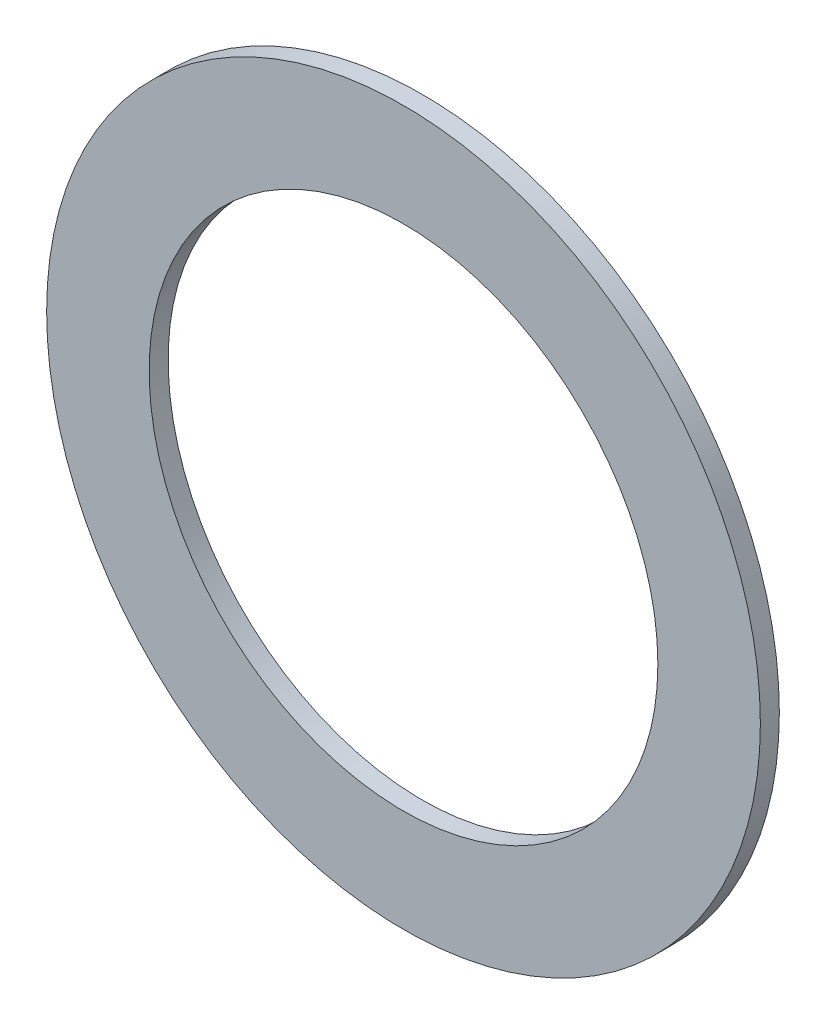
ISO-10303-21;
HEADER;
FILE_DESCRIPTION(('STEP AP214'),'2;1');
FILE_NAME('part.step','',(''),(''),'','','');
FILE_SCHEMA(('AUTOMOTIVE_DESIGN { 1 0 10303 214 1 1 1 1 }'));
ENDSEC;
DATA;
#1=APPLICATION_CONTEXT('core data for automotive mechanical design processes');
#2=APPLICATION_PROTOCOL_DEFINITION('international standard','automotive_design',2000,#1);
#3=PRODUCT_CONTEXT('',#1,'mechanical');
#4=PRODUCT('Part','Part','',(#3));
#5=PRODUCT_RELATED_PRODUCT_CATEGORY('part','',(#4));
#6=PRODUCT_DEFINITION_FORMATION('','',#4);
#7=PRODUCT_DEFINITION_CONTEXT('part definition',#1,'design');
#8=PRODUCT_DEFINITION('design','',#6,#7);
#9=PRODUCT_DEFINITION_SHAPE('','',#8);
#10=(LENGTH_UNIT() NAMED_UNIT(*) SI_UNIT(.MILLI.,.METRE.));
#11=(NAMED_UNIT(*) PLANE_ANGLE_UNIT() SI_UNIT($,.RADIAN.));
#12=(NAMED_UNIT(*) SI_UNIT($,.STERADIAN.) SOLID_ANGLE_UNIT());
#13=UNCERTAINTY_MEASURE_WITH_UNIT(LENGTH_MEASURE(1.E-05),#10,'distance_accuracy_value','');
#14=(GEOMETRIC_REPRESENTATION_CONTEXT(3) GLOBAL_UNCERTAINTY_ASSIGNED_CONTEXT((#13)) GLOBAL_UNIT_ASSIGNED_CONTEXT((#10,
#11,#12)) REPRESENTATION_CONTEXT('',''));
#15=CARTESIAN_POINT('',(0.,0.,0.));
#16=DIRECTION('',(0.,0.,1.));
#17=DIRECTION('',(1.,0.,0.));
#18=AXIS2_PLACEMENT_3D('',#15,#16,#17);
#19=CARTESIAN_POINT('',(0.,0.,0.5));
#20=DIRECTION('',(0.,0.,1.));
#21=DIRECTION('',(1.,0.,0.));
#22=AXIS2_PLACEMENT_3D('',#19,#20,#21);
#23=PLANE('',#22);
#24=CARTESIAN_POINT('',(0.,0.,0.5));
#25=DIRECTION('',(0.,0.,1.));
#26=DIRECTION('',(1.,0.,0.));
#27=AXIS2_PLACEMENT_3D('',#24,#25,#26);
#28=CIRCLE('',#27,9.4);
#29=CARTESIAN_POINT('',(9.4,0.,0.5));
#30=VERTEX_POINT('',#29);
#31=EDGE_CURVE('E10',#30,#30,#28,.T.);
#32=ORIENTED_EDGE('',*,*,#31,.T.);
#33=EDGE_LOOP('',(#32));
#34=FACE_BOUND('',#33,.T.);
#35=CARTESIAN_POINT('',(0.,0.,0.5));
#36=DIRECTION('',(0.,0.,1.));
#37=DIRECTION('',(1.,0.,0.));
#38=AXIS2_PLACEMENT_3D('',#35,#36,#37);
#39=CIRCLE('',#38,6.7);
#40=CARTESIAN_POINT('',(6.7,0.,0.5));
#41=VERTEX_POINT('',#40);
#42=EDGE_CURVE('E46',#41,#41,#39,.T.);
#43=ORIENTED_EDGE('',*,*,#42,.F.);
#44=EDGE_LOOP('',(#43));
#45=FACE_BOUND('',#44,.T.);
#46=ADVANCED_FACE('F35',(#34,#45),#23,.T.);
#47=CARTESIAN_POINT('',(0.,0.,0.));
#48=DIRECTION('',(0.,0.,1.));
#49=DIRECTION('',(1.,0.,0.));
#50=AXIS2_PLACEMENT_3D('',#47,#48,#49);
#51=PLANE('',#50);
#52=CARTESIAN_POINT('',(0.,0.,0.));
#53=DIRECTION('',(0.,0.,1.));
#54=DIRECTION('',(1.,0.,0.));
#55=AXIS2_PLACEMENT_3D('',#52,#53,#54);
#56=CIRCLE('',#55,9.4);
#57=CARTESIAN_POINT('',(9.4,0.,0.));
#58=VERTEX_POINT('',#57);
#59=EDGE_CURVE('E39',#58,#58,#56,.T.);
#60=ORIENTED_EDGE('',*,*,#59,.F.);
#61=EDGE_LOOP('',(#60));
#62=FACE_BOUND('',#61,.T.);
#63=CARTESIAN_POINT('',(0.,0.,0.));
#64=DIRECTION('',(0.,0.,1.));
#65=DIRECTION('',(1.,0.,0.));
#66=AXIS2_PLACEMENT_3D('',#63,#64,#65);
#67=CIRCLE('',#66,6.7);
#68=CARTESIAN_POINT('',(6.7,0.,0.));
#69=VERTEX_POINT('',#68);
#70=EDGE_CURVE('E48',#69,#69,#67,.T.);
#71=ORIENTED_EDGE('',*,*,#70,.T.);
#72=EDGE_LOOP('',(#71));
#73=FACE_BOUND('',#72,.T.);
#74=ADVANCED_FACE('F58',(#62,#73),#51,.F.);
#75=CARTESIAN_POINT('',(0.,0.,0.5));
#76=DIRECTION('',(0.,0.,-1.));
#77=DIRECTION('',(-1.,0.,0.));
#78=AXIS2_PLACEMENT_3D('',#75,#76,#77);
#79=CYLINDRICAL_SURFACE('',#78,9.4);
#80=ORIENTED_EDGE('',*,*,#31,.F.);
#81=EDGE_LOOP('',(#80));
#82=FACE_BOUND('',#81,.T.);
#83=ORIENTED_EDGE('',*,*,#59,.T.);
#84=EDGE_LOOP('',(#83));
#85=FACE_BOUND('',#84,.T.);
#86=ADVANCED_FACE('F37',(#82,#85),#79,.T.);
#87=CARTESIAN_POINT('',(0.,0.,0.5));
#88=DIRECTION('',(0.,0.,-1.));
#89=DIRECTION('',(-1.,0.,0.));
#90=AXIS2_PLACEMENT_3D('',#87,#88,#89);
#91=CYLINDRICAL_SURFACE('',#90,6.7);
#92=ORIENTED_EDGE('',*,*,#42,.T.);
#93=EDGE_LOOP('',(#92));
#94=FACE_BOUND('',#93,.T.);
#95=ORIENTED_EDGE('',*,*,#70,.F.);
#96=EDGE_LOOP('',(#95));
#97=FACE_BOUND('',#96,.T.);
#98=ADVANCED_FACE('F54',(#94,#97),#91,.F.);
#99=CLOSED_SHELL('',(#46,#74,#86,#98));
#100=MANIFOLD_SOLID_BREP('B2',#99);
#101=ADVANCED_BREP_SHAPE_REPRESENTATION('',(#18,#100),#14);
#102=SHAPE_DEFINITION_REPRESENTATION(#9,#101);
ENDSEC;
END-ISO-10303-21;
